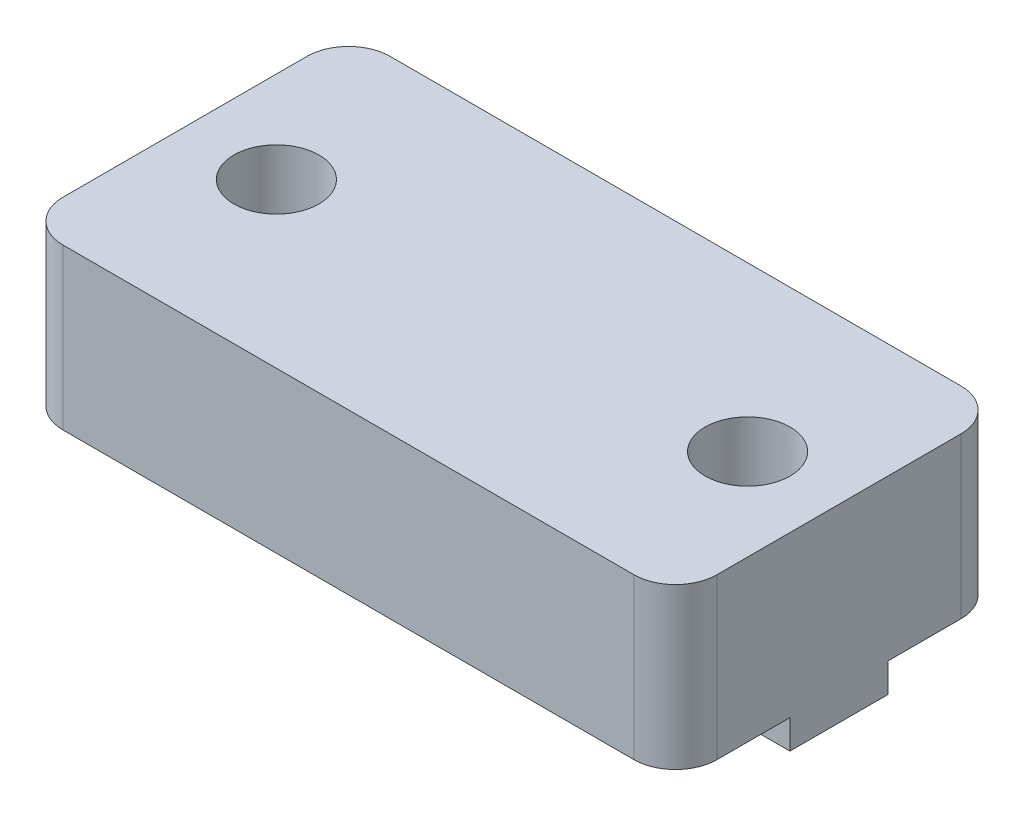
ISO-10303-21;
HEADER;
FILE_DESCRIPTION(('STEP AP214'),'2;1');
FILE_NAME('part.step','',(''),(''),'','','');
FILE_SCHEMA(('AUTOMOTIVE_DESIGN { 1 0 10303 214 1 1 1 1 }'));
ENDSEC;
DATA;
#1=APPLICATION_CONTEXT('core data for automotive mechanical design processes');
#2=APPLICATION_PROTOCOL_DEFINITION('international standard','automotive_design',2000,#1);
#3=PRODUCT_CONTEXT('',#1,'mechanical');
#4=PRODUCT('Part','Part','',(#3));
#5=PRODUCT_RELATED_PRODUCT_CATEGORY('part','',(#4));
#6=PRODUCT_DEFINITION_FORMATION('','',#4);
#7=PRODUCT_DEFINITION_CONTEXT('part definition',#1,'design');
#8=PRODUCT_DEFINITION('design','',#6,#7);
#9=PRODUCT_DEFINITION_SHAPE('','',#8);
#10=(LENGTH_UNIT() NAMED_UNIT(*) SI_UNIT(.MILLI.,.METRE.));
#11=(NAMED_UNIT(*) PLANE_ANGLE_UNIT() SI_UNIT($,.RADIAN.));
#12=(NAMED_UNIT(*) SI_UNIT($,.STERADIAN.) SOLID_ANGLE_UNIT());
#13=UNCERTAINTY_MEASURE_WITH_UNIT(LENGTH_MEASURE(1.E-05),#10,'distance_accuracy_value','');
#14=(GEOMETRIC_REPRESENTATION_CONTEXT(3) GLOBAL_UNCERTAINTY_ASSIGNED_CONTEXT((#13)) GLOBAL_UNIT_ASSIGNED_CONTEXT((#10,
#11,#12)) REPRESENTATION_CONTEXT('',''));
#15=CARTESIAN_POINT('',(0.,0.,0.));
#16=DIRECTION('',(0.,0.,1.));
#17=DIRECTION('',(1.,0.,0.));
#18=AXIS2_PLACEMENT_3D('',#15,#16,#17);
#19=CARTESIAN_POINT('',(20.,-4.9,-2.99999999999999));
#20=DIRECTION('',(0.,1.,0.));
#21=DIRECTION('',(0.,0.,1.));
#22=AXIS2_PLACEMENT_3D('',#19,#20,#21);
#23=PLANE('',#22);
#24=DIRECTION('',(0.,0.,-1.));
#25=VECTOR('',#24,1.);
#26=CARTESIAN_POINT('',(-20.,-4.9,-2.99999999999999));
#27=LINE('',#26,#25);
#28=CARTESIAN_POINT('',(-20.,-4.9,-2.99999999999999));
#29=VERTEX_POINT('',#28);
#30=CARTESIAN_POINT('',(-20.,-4.9,-7.46));
#31=VERTEX_POINT('',#30);
#32=EDGE_CURVE('E157',#29,#31,#27,.T.);
#33=ORIENTED_EDGE('',*,*,#32,.T.);
#34=CARTESIAN_POINT('',(-17.46,-4.9,-7.46));
#35=DIRECTION('',(0.,1.,0.));
#36=DIRECTION('',(0.,0.,1.));
#37=AXIS2_PLACEMENT_3D('',#34,#35,#36);
#38=CIRCLE('',#37,2.54);
#39=CARTESIAN_POINT('',(-17.46,-4.9,-10.));
#40=VERTEX_POINT('',#39);
#41=EDGE_CURVE('E207',#31,#40,#38,.F.);
#42=ORIENTED_EDGE('',*,*,#41,.T.);
#43=DIRECTION('',(-1.,0.,0.));
#44=VECTOR('',#43,1.);
#45=CARTESIAN_POINT('',(20.,-4.9,-10.));
#46=LINE('',#45,#44);
#47=CARTESIAN_POINT('',(17.46,-4.9,-10.));
#48=VERTEX_POINT('',#47);
#49=EDGE_CURVE('E185',#48,#40,#46,.T.);
#50=ORIENTED_EDGE('',*,*,#49,.F.);
#51=CARTESIAN_POINT('',(17.46,-4.9,-7.46));
#52=DIRECTION('',(0.,1.,0.));
#53=DIRECTION('',(0.,0.,1.));
#54=AXIS2_PLACEMENT_3D('',#51,#52,#53);
#55=CIRCLE('',#54,2.54);
#56=CARTESIAN_POINT('',(20.,-4.9,-7.46));
#57=VERTEX_POINT('',#56);
#58=EDGE_CURVE('E205',#48,#57,#55,.F.);
#59=ORIENTED_EDGE('',*,*,#58,.T.);
#60=DIRECTION('',(0.,0.,-1.));
#61=VECTOR('',#60,1.);
#62=CARTESIAN_POINT('',(20.,-4.9,-2.99999999999999));
#63=LINE('',#62,#61);
#64=CARTESIAN_POINT('',(20.,-4.9,-2.99999999999999));
#65=VERTEX_POINT('',#64);
#66=EDGE_CURVE('E171',#65,#57,#63,.T.);
#67=ORIENTED_EDGE('',*,*,#66,.F.);
#68=DIRECTION('',(-1.,0.,0.));
#69=VECTOR('',#68,1.);
#70=CARTESIAN_POINT('',(20.,-4.9,-2.99999999999999));
#71=LINE('',#70,#69);
#72=EDGE_CURVE('E156',#65,#29,#71,.T.);
#73=ORIENTED_EDGE('',*,*,#72,.T.);
#74=EDGE_LOOP('',(#33,#42,#50,#59,#67,#73));
#75=FACE_BOUND('',#74,.T.);
#76=ADVANCED_FACE('F35',(#75),#23,.F.);
#77=CARTESIAN_POINT('',(20.,4.9,-10.));
#78=DIRECTION('',(0.,0.,1.));
#79=DIRECTION('',(1.,0.,0.));
#80=AXIS2_PLACEMENT_3D('',#77,#78,#79);
#81=PLANE('',#80);
#82=ORIENTED_EDGE('',*,*,#49,.T.);
#83=DIRECTION('',(0.,1.,0.));
#84=VECTOR('',#83,1.);
#85=CARTESIAN_POINT('',(-17.46,4.9,-10.));
#86=LINE('',#85,#84);
#87=CARTESIAN_POINT('',(-17.46,4.9,-10.));
#88=VERTEX_POINT('',#87);
#89=EDGE_CURVE('E190',#40,#88,#86,.T.);
#90=ORIENTED_EDGE('',*,*,#89,.T.);
#91=DIRECTION('',(-1.,0.,0.));
#92=VECTOR('',#91,1.);
#93=CARTESIAN_POINT('',(20.,4.9,-10.));
#94=LINE('',#93,#92);
#95=CARTESIAN_POINT('',(17.46,4.9,-10.));
#96=VERTEX_POINT('',#95);
#97=EDGE_CURVE('E182',#96,#88,#94,.T.);
#98=ORIENTED_EDGE('',*,*,#97,.F.);
#99=DIRECTION('',(0.,1.,0.));
#100=VECTOR('',#99,1.);
#101=CARTESIAN_POINT('',(17.46,4.9,-10.));
#102=LINE('',#101,#100);
#103=EDGE_CURVE('E188',#96,#48,#102,.F.);
#104=ORIENTED_EDGE('',*,*,#103,.T.);
#105=EDGE_LOOP('',(#82,#90,#98,#104));
#106=FACE_BOUND('',#105,.T.);
#107=ADVANCED_FACE('F236',(#106),#81,.F.);
#108=CARTESIAN_POINT('',(20.,4.9,10.));
#109=DIRECTION('',(0.,-1.,0.));
#110=DIRECTION('',(0.,0.,-1.));
#111=AXIS2_PLACEMENT_3D('',#108,#109,#110);
#112=PLANE('',#111);
#113=CARTESIAN_POINT('',(14.412,4.9,0.));
#114=DIRECTION('',(0.,1.,0.));
#115=DIRECTION('',(0.,0.,-1.));
#116=AXIS2_PLACEMENT_3D('',#113,#114,#115);
#117=CIRCLE('',#116,2.6);
#118=CARTESIAN_POINT('',(14.412,4.9,-2.6));
#119=VERTEX_POINT('',#118);
#120=EDGE_CURVE('E256',#119,#119,#117,.T.);
#121=ORIENTED_EDGE('',*,*,#120,.F.);
#122=EDGE_LOOP('',(#121));
#123=FACE_BOUND('',#122,.T.);
#124=CARTESIAN_POINT('',(-14.412,4.9,0.));
#125=DIRECTION('',(0.,1.,0.));
#126=DIRECTION('',(0.,0.,1.));
#127=AXIS2_PLACEMENT_3D('',#124,#125,#126);
#128=CIRCLE('',#127,2.6);
#129=CARTESIAN_POINT('',(-14.412,4.9,2.6));
#130=VERTEX_POINT('',#129);
#131=EDGE_CURVE('E250',#130,#130,#128,.T.);
#132=ORIENTED_EDGE('',*,*,#131,.F.);
#133=EDGE_LOOP('',(#132));
#134=FACE_BOUND('',#133,.T.);
#135=ORIENTED_EDGE('',*,*,#97,.T.);
#136=CARTESIAN_POINT('',(-17.46,4.9,-7.46));
#137=DIRECTION('',(0.,-1.,0.));
#138=DIRECTION('',(0.,0.,-1.));
#139=AXIS2_PLACEMENT_3D('',#136,#137,#138);
#140=CIRCLE('',#139,2.54);
#141=CARTESIAN_POINT('',(-20.,4.9,-7.46));
#142=VERTEX_POINT('',#141);
#143=EDGE_CURVE('E199',#88,#142,#140,.F.);
#144=ORIENTED_EDGE('',*,*,#143,.T.);
#145=DIRECTION('',(0.,0.,1.));
#146=VECTOR('',#145,1.);
#147=CARTESIAN_POINT('',(-20.,4.9,10.));
#148=LINE('',#147,#146);
#149=CARTESIAN_POINT('',(-20.,4.9,7.46));
#150=VERTEX_POINT('',#149);
#151=EDGE_CURVE('E160',#142,#150,#148,.T.);
#152=ORIENTED_EDGE('',*,*,#151,.T.);
#153=CARTESIAN_POINT('',(-17.46,4.9,7.46));
#154=DIRECTION('',(0.,-1.,0.));
#155=DIRECTION('',(0.,0.,-1.));
#156=AXIS2_PLACEMENT_3D('',#153,#154,#155);
#157=CIRCLE('',#156,2.54);
#158=CARTESIAN_POINT('',(-17.46,4.9,10.));
#159=VERTEX_POINT('',#158);
#160=EDGE_CURVE('E193',#150,#159,#157,.F.);
#161=ORIENTED_EDGE('',*,*,#160,.T.);
#162=DIRECTION('',(-1.,0.,0.));
#163=VECTOR('',#162,1.);
#164=CARTESIAN_POINT('',(20.,4.9,10.));
#165=LINE('',#164,#163);
#166=CARTESIAN_POINT('',(17.46,4.9,10.));
#167=VERTEX_POINT('',#166);
#168=EDGE_CURVE('E179',#167,#159,#165,.T.);
#169=ORIENTED_EDGE('',*,*,#168,.F.);
#170=CARTESIAN_POINT('',(17.46,4.9,7.46));
#171=DIRECTION('',(0.,-1.,0.));
#172=DIRECTION('',(0.,0.,-1.));
#173=AXIS2_PLACEMENT_3D('',#170,#171,#172);
#174=CIRCLE('',#173,2.54);
#175=CARTESIAN_POINT('',(20.,4.9,7.46));
#176=VERTEX_POINT('',#175);
#177=EDGE_CURVE('E195',#167,#176,#174,.F.);
#178=ORIENTED_EDGE('',*,*,#177,.T.);
#179=DIRECTION('',(0.,0.,1.));
#180=VECTOR('',#179,1.);
#181=CARTESIAN_POINT('',(20.,4.9,10.));
#182=LINE('',#181,#180);
#183=CARTESIAN_POINT('',(20.,4.9,-7.46));
#184=VERTEX_POINT('',#183);
#185=EDGE_CURVE('E134',#184,#176,#182,.T.);
#186=ORIENTED_EDGE('',*,*,#185,.F.);
#187=CARTESIAN_POINT('',(17.46,4.9,-7.46));
#188=DIRECTION('',(0.,-1.,0.));
#189=DIRECTION('',(0.,0.,-1.));
#190=AXIS2_PLACEMENT_3D('',#187,#188,#189);
#191=CIRCLE('',#190,2.54);
#192=EDGE_CURVE('E197',#184,#96,#191,.F.);
#193=ORIENTED_EDGE('',*,*,#192,.T.);
#194=EDGE_LOOP('',(#135,#144,#152,#161,#169,#178,#186,#193));
#195=FACE_BOUND('',#194,.T.);
#196=ADVANCED_FACE('F224',(#123,#134,#195),#112,.F.);
#197=CARTESIAN_POINT('',(20.,4.9,10.));
#198=DIRECTION('',(0.,0.,-1.));
#199=DIRECTION('',(-1.,0.,0.));
#200=AXIS2_PLACEMENT_3D('',#197,#198,#199);
#201=PLANE('',#200);
#202=DIRECTION('',(-1.,0.,0.));
#203=VECTOR('',#202,1.);
#204=CARTESIAN_POINT('',(20.,-4.9,10.));
#205=LINE('',#204,#203);
#206=CARTESIAN_POINT('',(17.46,-4.9,10.));
#207=VERTEX_POINT('',#206);
#208=CARTESIAN_POINT('',(-17.46,-4.9,10.));
#209=VERTEX_POINT('',#208);
#210=EDGE_CURVE('E143',#207,#209,#205,.T.);
#211=ORIENTED_EDGE('',*,*,#210,.F.);
#212=DIRECTION('',(0.,-1.,0.));
#213=VECTOR('',#212,1.);
#214=CARTESIAN_POINT('',(17.46,4.9,10.));
#215=LINE('',#214,#213);
#216=EDGE_CURVE('E11',#207,#167,#215,.F.);
#217=ORIENTED_EDGE('',*,*,#216,.T.);
#218=ORIENTED_EDGE('',*,*,#168,.T.);
#219=DIRECTION('',(0.,-1.,0.));
#220=VECTOR('',#219,1.);
#221=CARTESIAN_POINT('',(-17.46,-4.9,10.));
#222=LINE('',#221,#220);
#223=EDGE_CURVE('E43',#159,#209,#222,.T.);
#224=ORIENTED_EDGE('',*,*,#223,.T.);
#225=EDGE_LOOP('',(#211,#217,#218,#224));
#226=FACE_BOUND('',#225,.T.);
#227=ADVANCED_FACE('F215',(#226),#201,.F.);
#228=CARTESIAN_POINT('',(20.,-4.9,10.));
#229=DIRECTION('',(0.,1.,0.));
#230=DIRECTION('',(0.,0.,1.));
#231=AXIS2_PLACEMENT_3D('',#228,#229,#230);
#232=PLANE('',#231);
#233=DIRECTION('',(0.,0.,-1.));
#234=VECTOR('',#233,1.);
#235=CARTESIAN_POINT('',(20.,-4.9,10.));
#236=LINE('',#235,#234);
#237=CARTESIAN_POINT('',(20.,-4.9,7.46));
#238=VERTEX_POINT('',#237);
#239=CARTESIAN_POINT('',(20.,-4.9,2.99999999999999));
#240=VERTEX_POINT('',#239);
#241=EDGE_CURVE('E124',#238,#240,#236,.T.);
#242=ORIENTED_EDGE('',*,*,#241,.F.);
#243=CARTESIAN_POINT('',(17.46,-4.9,7.46));
#244=DIRECTION('',(0.,1.,0.));
#245=DIRECTION('',(0.,0.,1.));
#246=AXIS2_PLACEMENT_3D('',#243,#244,#245);
#247=CIRCLE('',#246,2.54);
#248=EDGE_CURVE('E58',#238,#207,#247,.F.);
#249=ORIENTED_EDGE('',*,*,#248,.T.);
#250=ORIENTED_EDGE('',*,*,#210,.T.);
#251=CARTESIAN_POINT('',(-17.46,-4.9,7.46));
#252=DIRECTION('',(0.,1.,0.));
#253=DIRECTION('',(0.,0.,1.));
#254=AXIS2_PLACEMENT_3D('',#251,#252,#253);
#255=CIRCLE('',#254,2.54);
#256=CARTESIAN_POINT('',(-20.,-4.9,7.46));
#257=VERTEX_POINT('',#256);
#258=EDGE_CURVE('E50',#209,#257,#255,.F.);
#259=ORIENTED_EDGE('',*,*,#258,.T.);
#260=DIRECTION('',(0.,0.,-1.));
#261=VECTOR('',#260,1.);
#262=CARTESIAN_POINT('',(-20.,-4.9,10.));
#263=LINE('',#262,#261);
#264=CARTESIAN_POINT('',(-20.,-4.9,2.99999999999999));
#265=VERTEX_POINT('',#264);
#266=EDGE_CURVE('E140',#257,#265,#263,.T.);
#267=ORIENTED_EDGE('',*,*,#266,.T.);
#268=DIRECTION('',(-1.,0.,0.));
#269=VECTOR('',#268,1.);
#270=CARTESIAN_POINT('',(20.,-4.9,2.99999999999999));
#271=LINE('',#270,#269);
#272=EDGE_CURVE('E137',#240,#265,#271,.T.);
#273=ORIENTED_EDGE('',*,*,#272,.F.);
#274=EDGE_LOOP('',(#242,#249,#250,#259,#267,#273));
#275=FACE_BOUND('',#274,.T.);
#276=ADVANCED_FACE('F138',(#275),#232,.F.);
#277=CARTESIAN_POINT('',(20.,-6.678,3.));
#278=DIRECTION('',(0.,0.,-1.));
#279=DIRECTION('',(0.,1.,0.));
#280=AXIS2_PLACEMENT_3D('',#277,#278,#279);
#281=PLANE('',#280);
#282=DIRECTION('',(0.,-1.,0.));
#283=VECTOR('',#282,1.);
#284=CARTESIAN_POINT('',(-20.,-6.678,3.));
#285=LINE('',#284,#283);
#286=CARTESIAN_POINT('',(-20.,-6.678,3.));
#287=VERTEX_POINT('',#286);
#288=EDGE_CURVE('E165',#265,#287,#285,.T.);
#289=ORIENTED_EDGE('',*,*,#288,.T.);
#290=DIRECTION('',(-1.,0.,0.));
#291=VECTOR('',#290,1.);
#292=CARTESIAN_POINT('',(20.,-6.678,3.));
#293=LINE('',#292,#291);
#294=CARTESIAN_POINT('',(20.,-6.678,3.));
#295=VERTEX_POINT('',#294);
#296=EDGE_CURVE('E144',#295,#287,#293,.T.);
#297=ORIENTED_EDGE('',*,*,#296,.F.);
#298=DIRECTION('',(0.,-1.,0.));
#299=VECTOR('',#298,1.);
#300=CARTESIAN_POINT('',(20.,-6.678,3.));
#301=LINE('',#300,#299);
#302=EDGE_CURVE('E129',#240,#295,#301,.T.);
#303=ORIENTED_EDGE('',*,*,#302,.F.);
#304=ORIENTED_EDGE('',*,*,#272,.T.);
#305=EDGE_LOOP('',(#289,#297,#303,#304));
#306=FACE_BOUND('',#305,.T.);
#307=ADVANCED_FACE('F146',(#306),#281,.F.);
#308=CARTESIAN_POINT('',(20.,-6.678,-3.));
#309=DIRECTION('',(0.,1.,0.));
#310=DIRECTION('',(0.,0.,1.));
#311=AXIS2_PLACEMENT_3D('',#308,#309,#310);
#312=PLANE('',#311);
#313=CARTESIAN_POINT('',(14.412,-6.678,0.));
#314=DIRECTION('',(0.,1.,0.));
#315=DIRECTION('',(0.,0.,1.));
#316=AXIS2_PLACEMENT_3D('',#313,#314,#315);
#317=CIRCLE('',#316,2.6);
#318=CARTESIAN_POINT('',(14.412,-6.678,2.6));
#319=VERTEX_POINT('',#318);
#320=EDGE_CURVE('E253',#319,#319,#317,.F.);
#321=ORIENTED_EDGE('',*,*,#320,.F.);
#322=EDGE_LOOP('',(#321));
#323=FACE_BOUND('',#322,.T.);
#324=CARTESIAN_POINT('',(-14.412,-6.678,0.));
#325=DIRECTION('',(0.,1.,0.));
#326=DIRECTION('',(0.,0.,1.));
#327=AXIS2_PLACEMENT_3D('',#324,#325,#326);
#328=CIRCLE('',#327,2.6);
#329=CARTESIAN_POINT('',(-14.412,-6.678,2.6));
#330=VERTEX_POINT('',#329);
#331=EDGE_CURVE('E161',#330,#330,#328,.F.);
#332=ORIENTED_EDGE('',*,*,#331,.F.);
#333=EDGE_LOOP('',(#332));
#334=FACE_BOUND('',#333,.T.);
#335=DIRECTION('',(0.,0.,-1.));
#336=VECTOR('',#335,1.);
#337=CARTESIAN_POINT('',(-20.,-6.678,-3.));
#338=LINE('',#337,#336);
#339=CARTESIAN_POINT('',(-20.,-6.678,-3.));
#340=VERTEX_POINT('',#339);
#341=EDGE_CURVE('E167',#287,#340,#338,.T.);
#342=ORIENTED_EDGE('',*,*,#341,.T.);
#343=DIRECTION('',(-1.,0.,0.));
#344=VECTOR('',#343,1.);
#345=CARTESIAN_POINT('',(20.,-6.678,-3.));
#346=LINE('',#345,#344);
#347=CARTESIAN_POINT('',(20.,-6.678,-3.));
#348=VERTEX_POINT('',#347);
#349=EDGE_CURVE('E174',#348,#340,#346,.T.);
#350=ORIENTED_EDGE('',*,*,#349,.F.);
#351=DIRECTION('',(0.,0.,-1.));
#352=VECTOR('',#351,1.);
#353=CARTESIAN_POINT('',(20.,-6.678,-3.));
#354=LINE('',#353,#352);
#355=EDGE_CURVE('E149',#295,#348,#354,.T.);
#356=ORIENTED_EDGE('',*,*,#355,.F.);
#357=ORIENTED_EDGE('',*,*,#296,.T.);
#358=EDGE_LOOP('',(#342,#350,#356,#357));
#359=FACE_BOUND('',#358,.T.);
#360=ADVANCED_FACE('F378',(#323,#334,#359),#312,.F.);
#361=CARTESIAN_POINT('',(20.,-4.9,-2.99999999999999));
#362=DIRECTION('',(0.,0.,1.));
#363=DIRECTION('',(0.,-1.,0.));
#364=AXIS2_PLACEMENT_3D('',#361,#362,#363);
#365=PLANE('',#364);
#366=DIRECTION('',(0.,1.,0.));
#367=VECTOR('',#366,1.);
#368=CARTESIAN_POINT('',(-20.,-4.9,-2.99999999999999));
#369=LINE('',#368,#367);
#370=EDGE_CURVE('E169',#340,#29,#369,.T.);
#371=ORIENTED_EDGE('',*,*,#370,.T.);
#372=ORIENTED_EDGE('',*,*,#72,.F.);
#373=DIRECTION('',(0.,1.,0.));
#374=VECTOR('',#373,1.);
#375=CARTESIAN_POINT('',(20.,-4.9,-2.99999999999999));
#376=LINE('',#375,#374);
#377=EDGE_CURVE('E151',#348,#65,#376,.T.);
#378=ORIENTED_EDGE('',*,*,#377,.F.);
#379=ORIENTED_EDGE('',*,*,#349,.T.);
#380=EDGE_LOOP('',(#371,#372,#378,#379));
#381=FACE_BOUND('',#380,.T.);
#382=ADVANCED_FACE('F330',(#381),#365,.F.);
#383=CARTESIAN_POINT('',(20.,0.,0.));
#384=DIRECTION('',(-1.,0.,0.));
#385=DIRECTION('',(0.,0.,1.));
#386=AXIS2_PLACEMENT_3D('',#383,#384,#385);
#387=PLANE('',#386);
#388=ORIENTED_EDGE('',*,*,#66,.T.);
#389=DIRECTION('',(0.,1.,0.));
#390=VECTOR('',#389,1.);
#391=CARTESIAN_POINT('',(20.,0.,-7.46));
#392=LINE('',#391,#390);
#393=EDGE_CURVE('E210',#57,#184,#392,.T.);
#394=ORIENTED_EDGE('',*,*,#393,.T.);
#395=ORIENTED_EDGE('',*,*,#185,.T.);
#396=DIRECTION('',(0.,-1.,0.));
#397=VECTOR('',#396,1.);
#398=CARTESIAN_POINT('',(20.,0.,7.46));
#399=LINE('',#398,#397);
#400=EDGE_CURVE('E133',#176,#238,#399,.T.);
#401=ORIENTED_EDGE('',*,*,#400,.T.);
#402=ORIENTED_EDGE('',*,*,#241,.T.);
#403=ORIENTED_EDGE('',*,*,#302,.T.);
#404=ORIENTED_EDGE('',*,*,#355,.T.);
#405=ORIENTED_EDGE('',*,*,#377,.T.);
#406=EDGE_LOOP('',(#388,#394,#395,#401,#402,#403,#404,#405));
#407=FACE_BOUND('',#406,.T.);
#408=ADVANCED_FACE('F127',(#407),#387,.F.);
#409=CARTESIAN_POINT('',(-20.,0.,0.));
#410=DIRECTION('',(-1.,0.,0.));
#411=DIRECTION('',(0.,0.,1.));
#412=AXIS2_PLACEMENT_3D('',#409,#410,#411);
#413=PLANE('',#412);
#414=ORIENTED_EDGE('',*,*,#151,.F.);
#415=DIRECTION('',(0.,1.,0.));
#416=VECTOR('',#415,1.);
#417=CARTESIAN_POINT('',(-20.,-4.9,-7.46));
#418=LINE('',#417,#416);
#419=EDGE_CURVE('E203',#142,#31,#418,.F.);
#420=ORIENTED_EDGE('',*,*,#419,.T.);
#421=ORIENTED_EDGE('',*,*,#32,.F.);
#422=ORIENTED_EDGE('',*,*,#370,.F.);
#423=ORIENTED_EDGE('',*,*,#341,.F.);
#424=ORIENTED_EDGE('',*,*,#288,.F.);
#425=ORIENTED_EDGE('',*,*,#266,.F.);
#426=DIRECTION('',(0.,-1.,0.));
#427=VECTOR('',#426,1.);
#428=CARTESIAN_POINT('',(-20.,4.9,7.46));
#429=LINE('',#428,#427);
#430=EDGE_CURVE('E201',#257,#150,#429,.F.);
#431=ORIENTED_EDGE('',*,*,#430,.T.);
#432=EDGE_LOOP('',(#414,#420,#421,#422,#423,#424,#425,#431));
#433=FACE_BOUND('',#432,.T.);
#434=ADVANCED_FACE('F221',(#433),#413,.T.);
#435=CARTESIAN_POINT('',(-14.412,-14.0319105243401,0.));
#436=DIRECTION('',(0.,1.,0.));
#437=DIRECTION('',(0.,0.,1.));
#438=AXIS2_PLACEMENT_3D('',#435,#436,#437);
#439=CYLINDRICAL_SURFACE('',#438,2.6);
#440=ORIENTED_EDGE('',*,*,#331,.T.);
#441=EDGE_LOOP('',(#440));
#442=FACE_BOUND('',#441,.T.);
#443=ORIENTED_EDGE('',*,*,#131,.T.);
#444=EDGE_LOOP('',(#443));
#445=FACE_BOUND('',#444,.T.);
#446=ADVANCED_FACE('F267',(#442,#445),#439,.F.);
#447=CARTESIAN_POINT('',(14.412,-14.0319105243401,0.));
#448=DIRECTION('',(0.,1.,0.));
#449=DIRECTION('',(0.,0.,1.));
#450=AXIS2_PLACEMENT_3D('',#447,#448,#449);
#451=CYLINDRICAL_SURFACE('',#450,2.6);
#452=ORIENTED_EDGE('',*,*,#320,.T.);
#453=EDGE_LOOP('',(#452));
#454=FACE_BOUND('',#453,.T.);
#455=ORIENTED_EDGE('',*,*,#120,.T.);
#456=EDGE_LOOP('',(#455));
#457=FACE_BOUND('',#456,.T.);
#458=ADVANCED_FACE('F260',(#454,#457),#451,.F.);
#459=CARTESIAN_POINT('',(-17.46,4.9,-7.46));
#460=DIRECTION('',(0.,-1.,0.));
#461=DIRECTION('',(0.,0.,-1.));
#462=AXIS2_PLACEMENT_3D('',#459,#460,#461);
#463=CYLINDRICAL_SURFACE('',#462,2.54);
#464=ORIENTED_EDGE('',*,*,#41,.F.);
#465=ORIENTED_EDGE('',*,*,#419,.F.);
#466=ORIENTED_EDGE('',*,*,#143,.F.);
#467=ORIENTED_EDGE('',*,*,#89,.F.);
#468=EDGE_LOOP('',(#464,#465,#466,#467));
#469=FACE_BOUND('',#468,.T.);
#470=ADVANCED_FACE('F230',(#469),#463,.T.);
#471=CARTESIAN_POINT('',(17.46,0.,-7.46));
#472=DIRECTION('',(0.,1.,0.));
#473=DIRECTION('',(0.,0.,1.));
#474=AXIS2_PLACEMENT_3D('',#471,#472,#473);
#475=CYLINDRICAL_SURFACE('',#474,2.54);
#476=ORIENTED_EDGE('',*,*,#58,.F.);
#477=ORIENTED_EDGE('',*,*,#103,.F.);
#478=ORIENTED_EDGE('',*,*,#192,.F.);
#479=ORIENTED_EDGE('',*,*,#393,.F.);
#480=EDGE_LOOP('',(#476,#477,#478,#479));
#481=FACE_BOUND('',#480,.T.);
#482=ADVANCED_FACE('F240',(#481),#475,.T.);
#483=CARTESIAN_POINT('',(17.46,0.,7.46));
#484=DIRECTION('',(0.,-1.,0.));
#485=DIRECTION('',(0.,0.,-1.));
#486=AXIS2_PLACEMENT_3D('',#483,#484,#485);
#487=CYLINDRICAL_SURFACE('',#486,2.54);
#488=ORIENTED_EDGE('',*,*,#177,.F.);
#489=ORIENTED_EDGE('',*,*,#216,.F.);
#490=ORIENTED_EDGE('',*,*,#248,.F.);
#491=ORIENTED_EDGE('',*,*,#400,.F.);
#492=EDGE_LOOP('',(#488,#489,#490,#491));
#493=FACE_BOUND('',#492,.T.);
#494=ADVANCED_FACE('F289',(#493),#487,.T.);
#495=CARTESIAN_POINT('',(-17.46,4.9,7.46));
#496=DIRECTION('',(0.,1.,0.));
#497=DIRECTION('',(0.,0.,1.));
#498=AXIS2_PLACEMENT_3D('',#495,#496,#497);
#499=CYLINDRICAL_SURFACE('',#498,2.54);
#500=ORIENTED_EDGE('',*,*,#160,.F.);
#501=ORIENTED_EDGE('',*,*,#430,.F.);
#502=ORIENTED_EDGE('',*,*,#258,.F.);
#503=ORIENTED_EDGE('',*,*,#223,.F.);
#504=EDGE_LOOP('',(#500,#501,#502,#503));
#505=FACE_BOUND('',#504,.T.);
#506=ADVANCED_FACE('F37',(#505),#499,.T.);
#507=CLOSED_SHELL('',(#76,#107,#196,#227,#276,#307,#360,#382,#408,#434,#446,#458,#470,#482,#494,#506));
#508=MANIFOLD_SOLID_BREP('B2',#507);
#509=ADVANCED_BREP_SHAPE_REPRESENTATION('',(#18,#508),#14);
#510=SHAPE_DEFINITION_REPRESENTATION(#9,#509);
ENDSEC;
END-ISO-10303-21;
